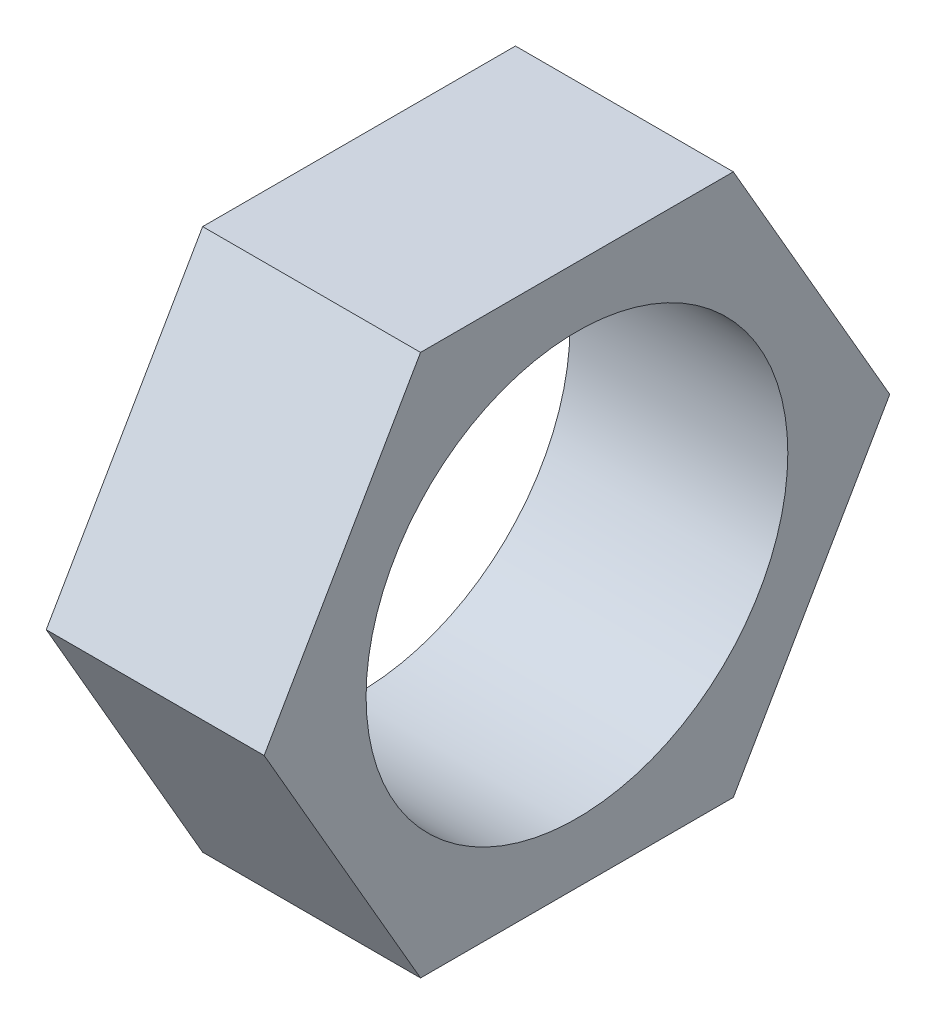
ISO-10303-21;
HEADER;
FILE_DESCRIPTION(('STEP AP214'),'2;1');
FILE_NAME('part.step','',(''),(''),'','','');
FILE_SCHEMA(('AUTOMOTIVE_DESIGN { 1 0 10303 214 1 1 1 1 }'));
ENDSEC;
DATA;
#1=APPLICATION_CONTEXT('core data for automotive mechanical design processes');
#2=APPLICATION_PROTOCOL_DEFINITION('international standard','automotive_design',2000,#1);
#3=PRODUCT_CONTEXT('',#1,'mechanical');
#4=PRODUCT('Part','Part','',(#3));
#5=PRODUCT_RELATED_PRODUCT_CATEGORY('part','',(#4));
#6=PRODUCT_DEFINITION_FORMATION('','',#4);
#7=PRODUCT_DEFINITION_CONTEXT('part definition',#1,'design');
#8=PRODUCT_DEFINITION('design','',#6,#7);
#9=PRODUCT_DEFINITION_SHAPE('','',#8);
#10=(LENGTH_UNIT() NAMED_UNIT(*) SI_UNIT(.MILLI.,.METRE.));
#11=(NAMED_UNIT(*) PLANE_ANGLE_UNIT() SI_UNIT($,.RADIAN.));
#12=(NAMED_UNIT(*) SI_UNIT($,.STERADIAN.) SOLID_ANGLE_UNIT());
#13=UNCERTAINTY_MEASURE_WITH_UNIT(LENGTH_MEASURE(1.E-05),#10,'distance_accuracy_value','');
#14=(GEOMETRIC_REPRESENTATION_CONTEXT(3) GLOBAL_UNCERTAINTY_ASSIGNED_CONTEXT((#13)) GLOBAL_UNIT_ASSIGNED_CONTEXT((#10,
#11,#12)) REPRESENTATION_CONTEXT('',''));
#15=CARTESIAN_POINT('',(0.,0.,0.));
#16=DIRECTION('',(0.,0.,1.));
#17=DIRECTION('',(1.,0.,0.));
#18=AXIS2_PLACEMENT_3D('',#15,#16,#17);
#19=CARTESIAN_POINT('',(3.1,-3.85381304684076,-2.22499999999999));
#20=DIRECTION('',(0.,0.500000000000001,0.866025403784438));
#21=DIRECTION('',(0.,-0.866025403784438,0.500000000000001));
#22=AXIS2_PLACEMENT_3D('',#19,#20,#21);
#23=PLANE('',#22);
#24=DIRECTION('',(0.,0.866025403784438,-0.500000000000001));
#25=VECTOR('',#24,1.);
#26=CARTESIAN_POINT('',(0.,-3.85381304684076,-2.22499999999999));
#27=LINE('',#26,#25);
#28=CARTESIAN_POINT('',(0.,-3.85381304684076,-2.22499999999999));
#29=VERTEX_POINT('',#28);
#30=CARTESIAN_POINT('',(0.,0.,-4.45));
#31=VERTEX_POINT('',#30);
#32=EDGE_CURVE('E119',#29,#31,#27,.T.);
#33=ORIENTED_EDGE('',*,*,#32,.T.);
#34=DIRECTION('',(-1.,0.,0.));
#35=VECTOR('',#34,1.);
#36=CARTESIAN_POINT('',(3.1,0.,-4.45));
#37=LINE('',#36,#35);
#38=CARTESIAN_POINT('',(3.1,0.,-4.45));
#39=VERTEX_POINT('',#38);
#40=EDGE_CURVE('E11',#39,#31,#37,.T.);
#41=ORIENTED_EDGE('',*,*,#40,.F.);
#42=DIRECTION('',(0.,0.866025403784438,-0.500000000000001));
#43=VECTOR('',#42,1.);
#44=CARTESIAN_POINT('',(3.1,-3.85381304684076,-2.22499999999999));
#45=LINE('',#44,#43);
#46=CARTESIAN_POINT('',(3.1,-3.85381304684076,-2.22499999999999));
#47=VERTEX_POINT('',#46);
#48=EDGE_CURVE('E130',#47,#39,#45,.T.);
#49=ORIENTED_EDGE('',*,*,#48,.F.);
#50=DIRECTION('',(-1.,0.,0.));
#51=VECTOR('',#50,1.);
#52=CARTESIAN_POINT('',(3.1,-3.85381304684076,-2.22499999999999));
#53=LINE('',#52,#51);
#54=EDGE_CURVE('E115',#47,#29,#53,.T.);
#55=ORIENTED_EDGE('',*,*,#54,.T.);
#56=EDGE_LOOP('',(#33,#41,#49,#55));
#57=FACE_BOUND('',#56,.T.);
#58=ADVANCED_FACE('F35',(#57),#23,.F.);
#59=CARTESIAN_POINT('',(3.1,0.,-4.45));
#60=DIRECTION('',(0.,-0.5,0.866025403784439));
#61=DIRECTION('',(0.,-0.866025403784439,-0.5));
#62=AXIS2_PLACEMENT_3D('',#59,#60,#61);
#63=PLANE('',#62);
#64=DIRECTION('',(0.,0.866025403784439,0.5));
#65=VECTOR('',#64,1.);
#66=CARTESIAN_POINT('',(0.,0.,-4.45));
#67=LINE('',#66,#65);
#68=CARTESIAN_POINT('',(0.,3.85381304684075,-2.225));
#69=VERTEX_POINT('',#68);
#70=EDGE_CURVE('E122',#31,#69,#67,.T.);
#71=ORIENTED_EDGE('',*,*,#70,.T.);
#72=DIRECTION('',(-1.,0.,0.));
#73=VECTOR('',#72,1.);
#74=CARTESIAN_POINT('',(3.1,3.85381304684075,-2.225));
#75=LINE('',#74,#73);
#76=CARTESIAN_POINT('',(3.1,3.85381304684075,-2.225));
#77=VERTEX_POINT('',#76);
#78=EDGE_CURVE('E43',#77,#69,#75,.T.);
#79=ORIENTED_EDGE('',*,*,#78,.F.);
#80=DIRECTION('',(0.,0.866025403784439,0.5));
#81=VECTOR('',#80,1.);
#82=CARTESIAN_POINT('',(3.1,0.,-4.45));
#83=LINE('',#82,#81);
#84=EDGE_CURVE('E88',#39,#77,#83,.T.);
#85=ORIENTED_EDGE('',*,*,#84,.F.);
#86=ORIENTED_EDGE('',*,*,#40,.T.);
#87=EDGE_LOOP('',(#71,#79,#85,#86));
#88=FACE_BOUND('',#87,.T.);
#89=ADVANCED_FACE('F155',(#88),#63,.F.);
#90=CARTESIAN_POINT('',(3.1,3.85381304684075,-2.225));
#91=DIRECTION('',(0.,-1.,0.));
#92=DIRECTION('',(0.,0.,-1.));
#93=AXIS2_PLACEMENT_3D('',#90,#91,#92);
#94=PLANE('',#93);
#95=DIRECTION('',(0.,0.,1.));
#96=VECTOR('',#95,1.);
#97=CARTESIAN_POINT('',(0.,3.85381304684075,-2.225));
#98=LINE('',#97,#96);
#99=CARTESIAN_POINT('',(0.,3.85381304684077,2.22499999999997));
#100=VERTEX_POINT('',#99);
#101=EDGE_CURVE('E125',#69,#100,#98,.T.);
#102=ORIENTED_EDGE('',*,*,#101,.T.);
#103=DIRECTION('',(-1.,0.,0.));
#104=VECTOR('',#103,1.);
#105=CARTESIAN_POINT('',(3.1,3.85381304684077,2.22499999999997));
#106=LINE('',#105,#104);
#107=CARTESIAN_POINT('',(3.1,3.85381304684077,2.22499999999997));
#108=VERTEX_POINT('',#107);
#109=EDGE_CURVE('E110',#108,#100,#106,.T.);
#110=ORIENTED_EDGE('',*,*,#109,.F.);
#111=DIRECTION('',(0.,0.,1.));
#112=VECTOR('',#111,1.);
#113=CARTESIAN_POINT('',(3.1,3.85381304684075,-2.225));
#114=LINE('',#113,#112);
#115=EDGE_CURVE('E101',#77,#108,#114,.T.);
#116=ORIENTED_EDGE('',*,*,#115,.F.);
#117=ORIENTED_EDGE('',*,*,#78,.T.);
#118=EDGE_LOOP('',(#102,#110,#116,#117));
#119=FACE_BOUND('',#118,.T.);
#120=ADVANCED_FACE('F136',(#119),#94,.F.);
#121=CARTESIAN_POINT('',(3.1,3.85381304684077,2.22499999999997));
#122=DIRECTION('',(0.,-0.500000000000007,-0.866025403784434));
#123=DIRECTION('',(0.,0.866025403784435,-0.500000000000007));
#124=AXIS2_PLACEMENT_3D('',#121,#122,#123);
#125=PLANE('',#124);
#126=DIRECTION('',(0.,-0.866025403784434,0.500000000000007));
#127=VECTOR('',#126,1.);
#128=CARTESIAN_POINT('',(0.,3.85381304684077,2.22499999999997));
#129=LINE('',#128,#127);
#130=CARTESIAN_POINT('',(0.,0.,4.45));
#131=VERTEX_POINT('',#130);
#132=EDGE_CURVE('E109',#100,#131,#129,.T.);
#133=ORIENTED_EDGE('',*,*,#132,.T.);
#134=DIRECTION('',(-1.,0.,0.));
#135=VECTOR('',#134,1.);
#136=CARTESIAN_POINT('',(3.1,0.,4.45));
#137=LINE('',#136,#135);
#138=CARTESIAN_POINT('',(3.1,0.,4.45));
#139=VERTEX_POINT('',#138);
#140=EDGE_CURVE('E106',#139,#131,#137,.T.);
#141=ORIENTED_EDGE('',*,*,#140,.F.);
#142=DIRECTION('',(0.,-0.866025403784434,0.500000000000007));
#143=VECTOR('',#142,1.);
#144=CARTESIAN_POINT('',(3.1,3.85381304684077,2.22499999999997));
#145=LINE('',#144,#143);
#146=EDGE_CURVE('E95',#108,#139,#145,.T.);
#147=ORIENTED_EDGE('',*,*,#146,.F.);
#148=ORIENTED_EDGE('',*,*,#109,.T.);
#149=EDGE_LOOP('',(#133,#141,#147,#148));
#150=FACE_BOUND('',#149,.T.);
#151=ADVANCED_FACE('F107',(#150),#125,.F.);
#152=CARTESIAN_POINT('',(3.1,0.,4.45));
#153=DIRECTION('',(0.,0.499999999999995,-0.866025403784442));
#154=DIRECTION('',(0.,0.866025403784442,0.499999999999995));
#155=AXIS2_PLACEMENT_3D('',#152,#153,#154);
#156=PLANE('',#155);
#157=DIRECTION('',(0.,-0.866025403784442,-0.499999999999995));
#158=VECTOR('',#157,1.);
#159=CARTESIAN_POINT('',(0.,0.,4.45));
#160=LINE('',#159,#158);
#161=CARTESIAN_POINT('',(0.,-3.85381304684074,2.22500000000002));
#162=VERTEX_POINT('',#161);
#163=EDGE_CURVE('E74',#131,#162,#160,.T.);
#164=ORIENTED_EDGE('',*,*,#163,.T.);
#165=DIRECTION('',(-1.,0.,0.));
#166=VECTOR('',#165,1.);
#167=CARTESIAN_POINT('',(3.1,-3.85381304684074,2.22500000000002));
#168=LINE('',#167,#166);
#169=CARTESIAN_POINT('',(3.1,-3.85381304684074,2.22500000000002));
#170=VERTEX_POINT('',#169);
#171=EDGE_CURVE('E111',#170,#162,#168,.T.);
#172=ORIENTED_EDGE('',*,*,#171,.F.);
#173=DIRECTION('',(0.,-0.866025403784442,-0.499999999999995));
#174=VECTOR('',#173,1.);
#175=CARTESIAN_POINT('',(3.1,0.,4.45));
#176=LINE('',#175,#174);
#177=EDGE_CURVE('E99',#139,#170,#176,.T.);
#178=ORIENTED_EDGE('',*,*,#177,.F.);
#179=ORIENTED_EDGE('',*,*,#140,.T.);
#180=EDGE_LOOP('',(#164,#172,#178,#179));
#181=FACE_BOUND('',#180,.T.);
#182=ADVANCED_FACE('F113',(#181),#156,.F.);
#183=CARTESIAN_POINT('',(3.1,-3.85381304684074,2.22500000000002));
#184=DIRECTION('',(0.,1.,0.));
#185=DIRECTION('',(0.,0.,1.));
#186=AXIS2_PLACEMENT_3D('',#183,#184,#185);
#187=PLANE('',#186);
#188=DIRECTION('',(0.,0.,-1.));
#189=VECTOR('',#188,1.);
#190=CARTESIAN_POINT('',(0.,-3.85381304684074,2.22500000000002));
#191=LINE('',#190,#189);
#192=EDGE_CURVE('E80',#162,#29,#191,.T.);
#193=ORIENTED_EDGE('',*,*,#192,.T.);
#194=ORIENTED_EDGE('',*,*,#54,.F.);
#195=DIRECTION('',(0.,0.,-1.));
#196=VECTOR('',#195,1.);
#197=CARTESIAN_POINT('',(3.1,-3.85381304684074,2.22500000000002));
#198=LINE('',#197,#196);
#199=EDGE_CURVE('E51',#170,#47,#198,.T.);
#200=ORIENTED_EDGE('',*,*,#199,.F.);
#201=ORIENTED_EDGE('',*,*,#171,.T.);
#202=EDGE_LOOP('',(#193,#194,#200,#201));
#203=FACE_BOUND('',#202,.T.);
#204=ADVANCED_FACE('F143',(#203),#187,.F.);
#205=CARTESIAN_POINT('',(3.1,0.,0.));
#206=DIRECTION('',(1.,0.,0.));
#207=DIRECTION('',(0.,0.,-1.));
#208=AXIS2_PLACEMENT_3D('',#205,#206,#207);
#209=PLANE('',#208);
#210=CARTESIAN_POINT('',(3.1,0.,0.));
#211=DIRECTION('',(1.,0.,0.));
#212=DIRECTION('',(0.,0.,-1.));
#213=AXIS2_PLACEMENT_3D('',#210,#211,#212);
#214=CIRCLE('',#213,3.);
#215=CARTESIAN_POINT('',(3.1,0.,-3.));
#216=VERTEX_POINT('',#215);
#217=EDGE_CURVE('E210',#216,#216,#214,.T.);
#218=ORIENTED_EDGE('',*,*,#217,.F.);
#219=EDGE_LOOP('',(#218));
#220=FACE_BOUND('',#219,.T.);
#221=ORIENTED_EDGE('',*,*,#48,.T.);
#222=ORIENTED_EDGE('',*,*,#84,.T.);
#223=ORIENTED_EDGE('',*,*,#115,.T.);
#224=ORIENTED_EDGE('',*,*,#146,.T.);
#225=ORIENTED_EDGE('',*,*,#177,.T.);
#226=ORIENTED_EDGE('',*,*,#199,.T.);
#227=EDGE_LOOP('',(#221,#222,#223,#224,#225,#226));
#228=FACE_BOUND('',#227,.T.);
#229=ADVANCED_FACE('F97',(#220,#228),#209,.T.);
#230=CARTESIAN_POINT('',(0.,0.,0.));
#231=DIRECTION('',(1.,0.,0.));
#232=DIRECTION('',(0.,0.,-1.));
#233=AXIS2_PLACEMENT_3D('',#230,#231,#232);
#234=PLANE('',#233);
#235=CARTESIAN_POINT('',(0.,0.,0.));
#236=DIRECTION('',(1.,0.,0.));
#237=DIRECTION('',(0.,0.,-1.));
#238=AXIS2_PLACEMENT_3D('',#235,#236,#237);
#239=CIRCLE('',#238,3.);
#240=CARTESIAN_POINT('',(0.,0.,-3.));
#241=VERTEX_POINT('',#240);
#242=EDGE_CURVE('E123',#241,#241,#239,.T.);
#243=ORIENTED_EDGE('',*,*,#242,.T.);
#244=EDGE_LOOP('',(#243));
#245=FACE_BOUND('',#244,.T.);
#246=ORIENTED_EDGE('',*,*,#32,.F.);
#247=ORIENTED_EDGE('',*,*,#192,.F.);
#248=ORIENTED_EDGE('',*,*,#163,.F.);
#249=ORIENTED_EDGE('',*,*,#132,.F.);
#250=ORIENTED_EDGE('',*,*,#101,.F.);
#251=ORIENTED_EDGE('',*,*,#70,.F.);
#252=EDGE_LOOP('',(#246,#247,#248,#249,#250,#251));
#253=FACE_BOUND('',#252,.T.);
#254=ADVANCED_FACE('F139',(#245,#253),#234,.F.);
#255=CARTESIAN_POINT('',(0.,0.,0.));
#256=DIRECTION('',(1.,0.,0.));
#257=DIRECTION('',(0.,0.,-1.));
#258=AXIS2_PLACEMENT_3D('',#255,#256,#257);
#259=CYLINDRICAL_SURFACE('',#258,3.);
#260=CARTESIAN_POINT('',(0.,0.,-3.));
#261=CARTESIAN_POINT('',(0.0322916666666666,0.,-3.));
#262=CARTESIAN_POINT('',(0.0645833333333333,0.,-3.));
#263=CARTESIAN_POINT('',(0.129166666666667,0.,-3.));
#264=CARTESIAN_POINT('',(0.161458333333333,0.,-3.));
#265=CARTESIAN_POINT('',(0.226041666666667,0.,-3.));
#266=CARTESIAN_POINT('',(0.258333333333333,0.,-3.));
#267=CARTESIAN_POINT('',(0.322916666666667,0.,-3.));
#268=CARTESIAN_POINT('',(0.355208333333333,0.,-3.));
#269=CARTESIAN_POINT('',(0.419791666666667,0.,-3.));
#270=CARTESIAN_POINT('',(0.452083333333333,0.,-3.));
#271=CARTESIAN_POINT('',(0.516666666666667,0.,-3.));
#272=CARTESIAN_POINT('',(0.548958333333333,0.,-3.));
#273=CARTESIAN_POINT('',(0.613541666666667,0.,-3.));
#274=CARTESIAN_POINT('',(0.645833333333333,0.,-3.));
#275=CARTESIAN_POINT('',(0.710416666666667,0.,-3.));
#276=CARTESIAN_POINT('',(0.742708333333333,0.,-3.));
#277=CARTESIAN_POINT('',(0.807291666666667,0.,-3.));
#278=CARTESIAN_POINT('',(0.839583333333333,0.,-3.));
#279=CARTESIAN_POINT('',(0.904166666666667,0.,-3.));
#280=CARTESIAN_POINT('',(0.936458333333333,0.,-3.));
#281=CARTESIAN_POINT('',(1.00104166666667,0.,-3.));
#282=CARTESIAN_POINT('',(1.03333333333333,0.,-3.));
#283=CARTESIAN_POINT('',(1.09791666666667,0.,-3.));
#284=CARTESIAN_POINT('',(1.13020833333333,0.,-3.));
#285=CARTESIAN_POINT('',(1.19479166666667,0.,-3.));
#286=CARTESIAN_POINT('',(1.22708333333333,0.,-3.));
#287=CARTESIAN_POINT('',(1.29166666666667,0.,-3.));
#288=CARTESIAN_POINT('',(1.32395833333333,0.,-3.));
#289=CARTESIAN_POINT('',(1.38854166666667,0.,-3.));
#290=CARTESIAN_POINT('',(1.42083333333333,0.,-3.));
#291=CARTESIAN_POINT('',(1.48541666666667,0.,-3.));
#292=CARTESIAN_POINT('',(1.51770833333333,0.,-3.));
#293=CARTESIAN_POINT('',(1.58229166666667,0.,-3.));
#294=CARTESIAN_POINT('',(1.61458333333333,0.,-3.));
#295=CARTESIAN_POINT('',(1.67916666666667,0.,-3.));
#296=CARTESIAN_POINT('',(1.71145833333333,0.,-3.));
#297=CARTESIAN_POINT('',(1.77604166666667,0.,-3.));
#298=CARTESIAN_POINT('',(1.80833333333333,0.,-3.));
#299=CARTESIAN_POINT('',(1.87291666666667,0.,-3.));
#300=CARTESIAN_POINT('',(1.90520833333333,0.,-3.));
#301=CARTESIAN_POINT('',(1.96979166666667,0.,-3.));
#302=CARTESIAN_POINT('',(2.00208333333333,0.,-3.));
#303=CARTESIAN_POINT('',(2.06666666666667,0.,-3.));
#304=CARTESIAN_POINT('',(2.09895833333333,0.,-3.));
#305=CARTESIAN_POINT('',(2.16354166666667,0.,-3.));
#306=CARTESIAN_POINT('',(2.19583333333333,0.,-3.));
#307=CARTESIAN_POINT('',(2.26041666666667,0.,-3.));
#308=CARTESIAN_POINT('',(2.29270833333333,0.,-3.));
#309=CARTESIAN_POINT('',(2.35729166666667,0.,-3.));
#310=CARTESIAN_POINT('',(2.38958333333333,0.,-3.));
#311=CARTESIAN_POINT('',(2.45416666666667,0.,-3.));
#312=CARTESIAN_POINT('',(2.48645833333333,0.,-3.));
#313=CARTESIAN_POINT('',(2.55104166666667,0.,-3.));
#314=CARTESIAN_POINT('',(2.58333333333333,0.,-3.));
#315=CARTESIAN_POINT('',(2.64791666666667,0.,-3.));
#316=CARTESIAN_POINT('',(2.68020833333333,0.,-3.));
#317=CARTESIAN_POINT('',(2.74479166666667,0.,-3.));
#318=CARTESIAN_POINT('',(2.77708333333333,0.,-3.));
#319=CARTESIAN_POINT('',(2.84166666666667,0.,-3.));
#320=CARTESIAN_POINT('',(2.87395833333333,0.,-3.));
#321=CARTESIAN_POINT('',(2.93854166666667,0.,-3.));
#322=CARTESIAN_POINT('',(2.97083333333333,0.,-3.));
#323=CARTESIAN_POINT('',(3.03541666666667,0.,-3.));
#324=CARTESIAN_POINT('',(3.06770833333333,0.,-3.));
#325=CARTESIAN_POINT('',(3.1,0.,-3.));
#326=B_SPLINE_CURVE_WITH_KNOTS('',3,(#260,#261,#262,#263,#264,#265,#266,#267,#268,#269,#270,
#271,#272,#273,#274,#275,#276,#277,#278,#279,#280,#281,#282,#283,#284,#285,#286,#287,#288,#289,
#290,#291,#292,#293,#294,#295,#296,#297,#298,#299,#300,#301,#302,#303,#304,#305,#306,#307,#308,
#309,#310,#311,#312,#313,#314,#315,#316,#317,#318,#319,#320,#321,#322,#323,#324,#325),
.UNSPECIFIED.,.F.,.F.,(4,2,2,2,2,2,2,2,2,2,2,2,2,2,2,2,2,2,2,2,2,2,2,2,2,2,2,2,2,2,2,2,4),(0.,
0.096875,0.19375,0.290625,0.3875,0.484375,0.58125,0.678125,0.775,0.871875,0.96875,1.065625,
1.1625,1.259375,1.35625,1.453125,1.55,1.646875,1.74375,1.840625,1.9375,2.034375,2.13125,
2.228125,2.325,2.421875,2.51875,2.615625,2.7125,2.809375,2.90625,3.003125,3.1),.UNSPECIFIED.);
#327=EDGE_CURVE('BSEAM192',#241,#216,#326,.T.);
#328=ORIENTED_EDGE('',*,*,#242,.F.);
#329=ORIENTED_EDGE('',*,*,#217,.T.);
#330=ORIENTED_EDGE('',*,*,#327,.T.);
#331=ORIENTED_EDGE('',*,*,#327,.F.);
#332=EDGE_LOOP('',(#328,#330,#329,#331));
#333=FACE_BOUND('',#332,.T.);
#334=ADVANCED_FACE('F192',(#333),#259,.F.);
#335=CLOSED_SHELL('',(#58,#89,#120,#151,#182,#204,#229,#254,#334));
#336=MANIFOLD_SOLID_BREP('B2',#335);
#337=ADVANCED_BREP_SHAPE_REPRESENTATION('',(#18,#336),#14);
#338=SHAPE_DEFINITION_REPRESENTATION(#9,#337);
ENDSEC;
END-ISO-10303-21;
